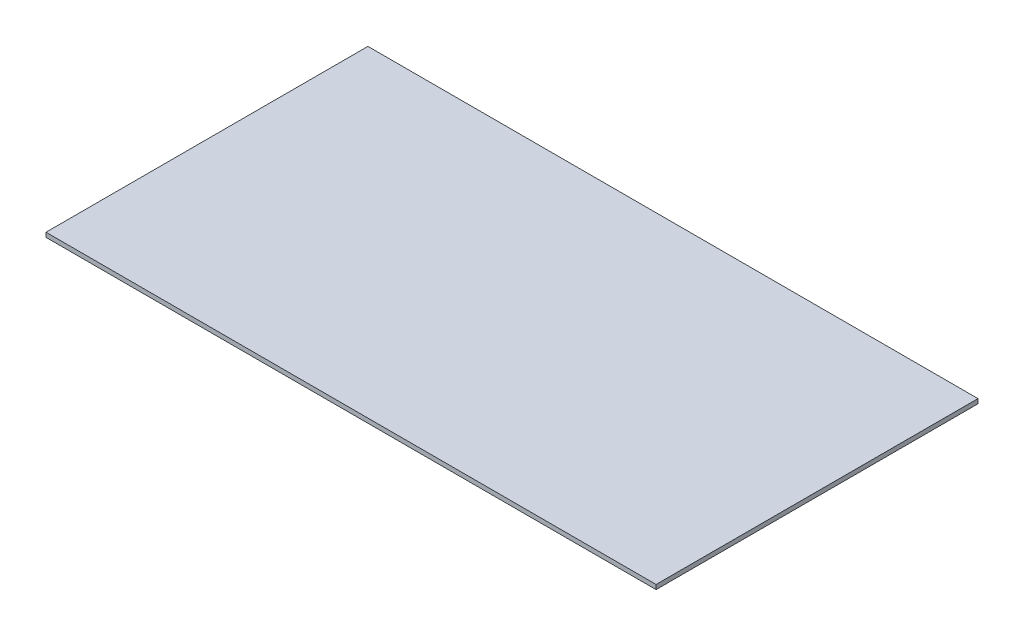
ISO-10303-21;
HEADER;
FILE_DESCRIPTION(('STEP AP214'),'2;1');
FILE_NAME('part.step','',(''),(''),'','','');
FILE_SCHEMA(('AUTOMOTIVE_DESIGN { 1 0 10303 214 1 1 1 1 }'));
ENDSEC;
DATA;
#1=APPLICATION_CONTEXT('core data for automotive mechanical design processes');
#2=APPLICATION_PROTOCOL_DEFINITION('international standard','automotive_design',2000,#1);
#3=PRODUCT_CONTEXT('',#1,'mechanical');
#4=PRODUCT('Part','Part','',(#3));
#5=PRODUCT_RELATED_PRODUCT_CATEGORY('part','',(#4));
#6=PRODUCT_DEFINITION_FORMATION('','',#4);
#7=PRODUCT_DEFINITION_CONTEXT('part definition',#1,'design');
#8=PRODUCT_DEFINITION('design','',#6,#7);
#9=PRODUCT_DEFINITION_SHAPE('','',#8);
#10=(LENGTH_UNIT() NAMED_UNIT(*) SI_UNIT(.MILLI.,.METRE.));
#11=(NAMED_UNIT(*) PLANE_ANGLE_UNIT() SI_UNIT($,.RADIAN.));
#12=(NAMED_UNIT(*) SI_UNIT($,.STERADIAN.) SOLID_ANGLE_UNIT());
#13=UNCERTAINTY_MEASURE_WITH_UNIT(LENGTH_MEASURE(1.E-05),#10,'distance_accuracy_value','');
#14=(GEOMETRIC_REPRESENTATION_CONTEXT(3) GLOBAL_UNCERTAINTY_ASSIGNED_CONTEXT((#13)) GLOBAL_UNIT_ASSIGNED_CONTEXT((#10,
#11,#12)) REPRESENTATION_CONTEXT('',''));
#15=CARTESIAN_POINT('',(0.,0.,0.));
#16=DIRECTION('',(0.,0.,1.));
#17=DIRECTION('',(1.,0.,0.));
#18=AXIS2_PLACEMENT_3D('',#15,#16,#17);
#19=CARTESIAN_POINT('',(0.,3.175,0.));
#20=DIRECTION('',(1.,0.,0.));
#21=DIRECTION('',(0.,0.,-1.));
#22=AXIS2_PLACEMENT_3D('',#19,#20,#21);
#23=PLANE('',#22);
#24=DIRECTION('',(0.,0.,1.));
#25=VECTOR('',#24,1.);
#26=CARTESIAN_POINT('',(0.,0.,0.));
#27=LINE('',#26,#25);
#28=CARTESIAN_POINT('',(0.,0.,-227.838));
#29=VERTEX_POINT('',#28);
#30=CARTESIAN_POINT('',(0.,0.,0.));
#31=VERTEX_POINT('',#30);
#32=EDGE_CURVE('E119',#29,#31,#27,.T.);
#33=ORIENTED_EDGE('',*,*,#32,.T.);
#34=DIRECTION('',(0.,-1.,0.));
#35=VECTOR('',#34,1.);
#36=CARTESIAN_POINT('',(0.,3.175,0.));
#37=LINE('',#36,#35);
#38=CARTESIAN_POINT('',(0.,3.175,0.));
#39=VERTEX_POINT('',#38);
#40=EDGE_CURVE('E11',#39,#31,#37,.T.);
#41=ORIENTED_EDGE('',*,*,#40,.F.);
#42=DIRECTION('',(0.,0.,1.));
#43=VECTOR('',#42,1.);
#44=CARTESIAN_POINT('',(0.,3.175,0.));
#45=LINE('',#44,#43);
#46=CARTESIAN_POINT('',(0.,3.175,-227.838));
#47=VERTEX_POINT('',#46);
#48=EDGE_CURVE('E103',#47,#39,#45,.T.);
#49=ORIENTED_EDGE('',*,*,#48,.F.);
#50=DIRECTION('',(0.,-1.,0.));
#51=VECTOR('',#50,1.);
#52=CARTESIAN_POINT('',(0.,3.175,-227.838));
#53=LINE('',#52,#51);
#54=EDGE_CURVE('E115',#47,#29,#53,.T.);
#55=ORIENTED_EDGE('',*,*,#54,.T.);
#56=EDGE_LOOP('',(#33,#41,#49,#55));
#57=FACE_BOUND('',#56,.T.);
#58=ADVANCED_FACE('F51',(#57),#23,.F.);
#59=CARTESIAN_POINT('',(0.,3.175,0.));
#60=DIRECTION('',(0.,0.,-1.));
#61=DIRECTION('',(-1.,0.,0.));
#62=AXIS2_PLACEMENT_3D('',#59,#60,#61);
#63=PLANE('',#62);
#64=DIRECTION('',(1.,0.,0.));
#65=VECTOR('',#64,1.);
#66=CARTESIAN_POINT('',(0.,0.,0.));
#67=LINE('',#66,#65);
#68=CARTESIAN_POINT('',(431.8,0.,0.));
#69=VERTEX_POINT('',#68);
#70=EDGE_CURVE('E108',#31,#69,#67,.T.);
#71=ORIENTED_EDGE('',*,*,#70,.T.);
#72=DIRECTION('',(0.,-1.,0.));
#73=VECTOR('',#72,1.);
#74=CARTESIAN_POINT('',(431.8,3.175,0.));
#75=LINE('',#74,#73);
#76=CARTESIAN_POINT('',(431.8,3.175,0.));
#77=VERTEX_POINT('',#76);
#78=EDGE_CURVE('E60',#77,#69,#75,.T.);
#79=ORIENTED_EDGE('',*,*,#78,.F.);
#80=DIRECTION('',(1.,0.,0.));
#81=VECTOR('',#80,1.);
#82=CARTESIAN_POINT('',(0.,3.175,0.));
#83=LINE('',#82,#81);
#84=EDGE_CURVE('E98',#39,#77,#83,.T.);
#85=ORIENTED_EDGE('',*,*,#84,.F.);
#86=ORIENTED_EDGE('',*,*,#40,.T.);
#87=EDGE_LOOP('',(#71,#79,#85,#86));
#88=FACE_BOUND('',#87,.T.);
#89=ADVANCED_FACE('F107',(#88),#63,.F.);
#90=CARTESIAN_POINT('',(431.8,3.175,0.));
#91=DIRECTION('',(-1.,0.,0.));
#92=DIRECTION('',(0.,0.,1.));
#93=AXIS2_PLACEMENT_3D('',#90,#91,#92);
#94=PLANE('',#93);
#95=DIRECTION('',(0.,0.,-1.));
#96=VECTOR('',#95,1.);
#97=CARTESIAN_POINT('',(431.8,0.,0.));
#98=LINE('',#97,#96);
#99=CARTESIAN_POINT('',(431.8,0.,-227.838));
#100=VERTEX_POINT('',#99);
#101=EDGE_CURVE('E85',#69,#100,#98,.T.);
#102=ORIENTED_EDGE('',*,*,#101,.T.);
#103=DIRECTION('',(0.,-1.,0.));
#104=VECTOR('',#103,1.);
#105=CARTESIAN_POINT('',(431.8,3.175,-227.838));
#106=LINE('',#105,#104);
#107=CARTESIAN_POINT('',(431.8,3.175,-227.838));
#108=VERTEX_POINT('',#107);
#109=EDGE_CURVE('E110',#108,#100,#106,.T.);
#110=ORIENTED_EDGE('',*,*,#109,.F.);
#111=DIRECTION('',(0.,0.,-1.));
#112=VECTOR('',#111,1.);
#113=CARTESIAN_POINT('',(431.8,3.175,0.));
#114=LINE('',#113,#112);
#115=EDGE_CURVE('E101',#77,#108,#114,.T.);
#116=ORIENTED_EDGE('',*,*,#115,.F.);
#117=ORIENTED_EDGE('',*,*,#78,.T.);
#118=EDGE_LOOP('',(#102,#110,#116,#117));
#119=FACE_BOUND('',#118,.T.);
#120=ADVANCED_FACE('F111',(#119),#94,.F.);
#121=CARTESIAN_POINT('',(0.,3.175,-227.838));
#122=DIRECTION('',(0.,0.,1.));
#123=DIRECTION('',(1.,0.,0.));
#124=AXIS2_PLACEMENT_3D('',#121,#122,#123);
#125=PLANE('',#124);
#126=DIRECTION('',(-1.,0.,0.));
#127=VECTOR('',#126,1.);
#128=CARTESIAN_POINT('',(0.,0.,-227.838));
#129=LINE('',#128,#127);
#130=EDGE_CURVE('E91',#100,#29,#129,.T.);
#131=ORIENTED_EDGE('',*,*,#130,.T.);
#132=ORIENTED_EDGE('',*,*,#54,.F.);
#133=DIRECTION('',(-1.,0.,0.));
#134=VECTOR('',#133,1.);
#135=CARTESIAN_POINT('',(0.,3.175,-227.838));
#136=LINE('',#135,#134);
#137=EDGE_CURVE('E68',#108,#47,#136,.T.);
#138=ORIENTED_EDGE('',*,*,#137,.F.);
#139=ORIENTED_EDGE('',*,*,#109,.T.);
#140=EDGE_LOOP('',(#131,#132,#138,#139));
#141=FACE_BOUND('',#140,.T.);
#142=ADVANCED_FACE('F132',(#141),#125,.F.);
#143=CARTESIAN_POINT('',(0.,3.175,0.));
#144=DIRECTION('',(0.,-1.,0.));
#145=DIRECTION('',(0.,0.,-1.));
#146=AXIS2_PLACEMENT_3D('',#143,#144,#145);
#147=PLANE('',#146);
#148=ORIENTED_EDGE('',*,*,#48,.T.);
#149=ORIENTED_EDGE('',*,*,#84,.T.);
#150=ORIENTED_EDGE('',*,*,#115,.T.);
#151=ORIENTED_EDGE('',*,*,#137,.T.);
#152=EDGE_LOOP('',(#148,#149,#150,#151));
#153=FACE_BOUND('',#152,.T.);
#154=ADVANCED_FACE('F99',(#153),#147,.F.);
#155=CARTESIAN_POINT('',(0.,0.,0.));
#156=DIRECTION('',(0.,-1.,0.));
#157=DIRECTION('',(0.,0.,-1.));
#158=AXIS2_PLACEMENT_3D('',#155,#156,#157);
#159=PLANE('',#158);
#160=ORIENTED_EDGE('',*,*,#32,.F.);
#161=ORIENTED_EDGE('',*,*,#130,.F.);
#162=ORIENTED_EDGE('',*,*,#101,.F.);
#163=ORIENTED_EDGE('',*,*,#70,.F.);
#164=EDGE_LOOP('',(#160,#161,#162,#163));
#165=FACE_BOUND('',#164,.T.);
#166=ADVANCED_FACE('F135',(#165),#159,.T.);
#167=CLOSED_SHELL('',(#58,#89,#120,#142,#154,#166));
#168=MANIFOLD_SOLID_BREP('B2',#167);
#169=ADVANCED_BREP_SHAPE_REPRESENTATION('',(#18,#168),#14);
#170=SHAPE_DEFINITION_REPRESENTATION(#9,#169);
ENDSEC;
END-ISO-10303-21;
